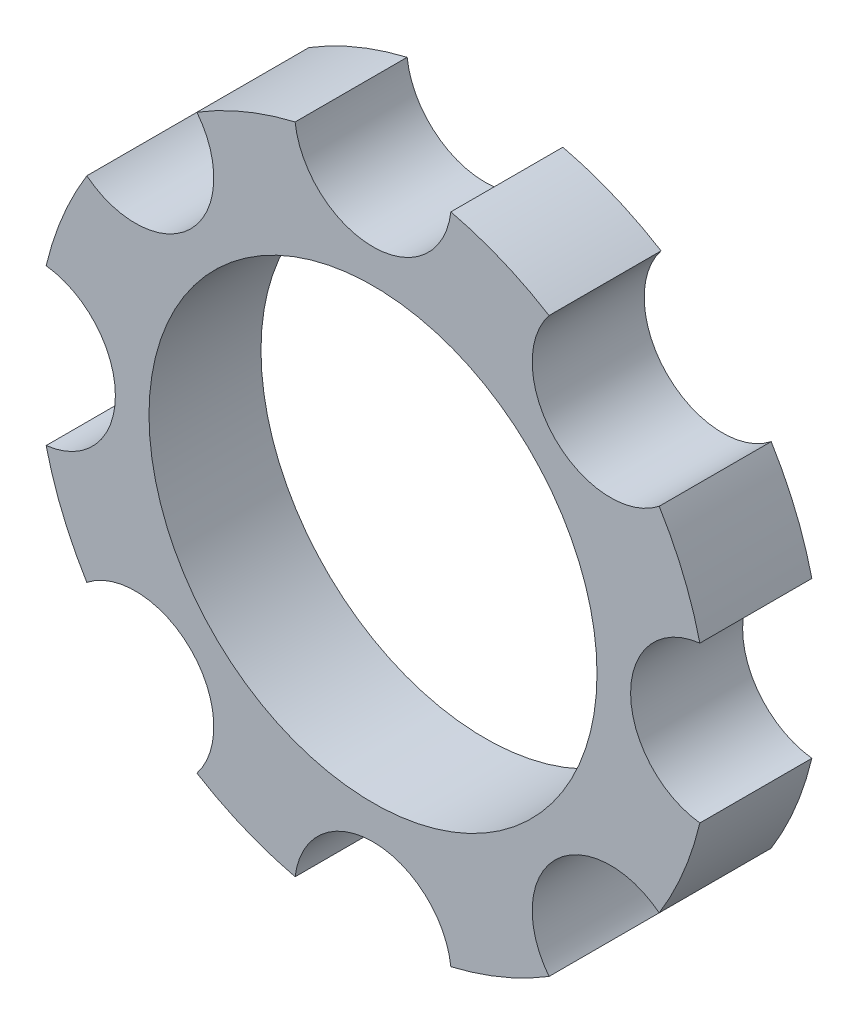
ISO-10303-21;
HEADER;
FILE_DESCRIPTION(('STEP AP214'),'2;1');
FILE_NAME('part.step','',(''),(''),'','','');
FILE_SCHEMA(('AUTOMOTIVE_DESIGN { 1 0 10303 214 1 1 1 1 }'));
ENDSEC;
DATA;
#1=APPLICATION_CONTEXT('core data for automotive mechanical design processes');
#2=APPLICATION_PROTOCOL_DEFINITION('international standard','automotive_design',2000,#1);
#3=PRODUCT_CONTEXT('',#1,'mechanical');
#4=PRODUCT('Part','Part','',(#3));
#5=PRODUCT_RELATED_PRODUCT_CATEGORY('part','',(#4));
#6=PRODUCT_DEFINITION_FORMATION('','',#4);
#7=PRODUCT_DEFINITION_CONTEXT('part definition',#1,'design');
#8=PRODUCT_DEFINITION('design','',#6,#7);
#9=PRODUCT_DEFINITION_SHAPE('','',#8);
#10=(LENGTH_UNIT() NAMED_UNIT(*) SI_UNIT(.MILLI.,.METRE.));
#11=(NAMED_UNIT(*) PLANE_ANGLE_UNIT() SI_UNIT($,.RADIAN.));
#12=(NAMED_UNIT(*) SI_UNIT($,.STERADIAN.) SOLID_ANGLE_UNIT());
#13=UNCERTAINTY_MEASURE_WITH_UNIT(LENGTH_MEASURE(1.E-05),#10,'distance_accuracy_value','');
#14=(GEOMETRIC_REPRESENTATION_CONTEXT(3) GLOBAL_UNCERTAINTY_ASSIGNED_CONTEXT((#13)) GLOBAL_UNIT_ASSIGNED_CONTEXT((#10,
#11,#12)) REPRESENTATION_CONTEXT('',''));
#15=CARTESIAN_POINT('',(0.,0.,0.));
#16=DIRECTION('',(0.,0.,1.));
#17=DIRECTION('',(1.,0.,0.));
#18=AXIS2_PLACEMENT_3D('',#15,#16,#17);
#19=CARTESIAN_POINT('',(0.,15.,10.));
#20=DIRECTION('',(0.,0.,1.));
#21=DIRECTION('',(1.,0.,0.));
#22=AXIS2_PLACEMENT_3D('',#19,#20,#21);
#23=PLANE('',#22);
#24=CARTESIAN_POINT('',(0.,0.,10.));
#25=DIRECTION('',(0.,0.,1.));
#26=DIRECTION('',(1.,0.,0.));
#27=AXIS2_PLACEMENT_3D('',#24,#25,#26);
#28=CIRCLE('',#27,30.);
#29=CARTESIAN_POINT('',(15.7197866227198,25.551679172535,10.));
#30=VERTEX_POINT('',#29);
#31=CARTESIAN_POINT('',(6.95219789387181,29.1833333333333,10.));
#32=VERTEX_POINT('',#31);
#33=EDGE_CURVE('E209',#30,#32,#28,.T.);
#34=ORIENTED_EDGE('',*,*,#33,.T.);
#35=CARTESIAN_POINT('',(0.,30.,10.));
#36=DIRECTION('',(0.,0.,-1.));
#37=DIRECTION('',(1.,0.,0.));
#38=AXIS2_PLACEMENT_3D('',#35,#36,#37);
#39=CIRCLE('',#38,7.00000000000001);
#40=CARTESIAN_POINT('',(-6.95219789387181,29.1833333333333,10.));
#41=VERTEX_POINT('',#40);
#42=EDGE_CURVE('E117',#32,#41,#39,.T.);
#43=ORIENTED_EDGE('',*,*,#42,.T.);
#44=CARTESIAN_POINT('',(0.,0.,10.));
#45=DIRECTION('',(0.,0.,1.));
#46=DIRECTION('',(1.,0.,0.));
#47=AXIS2_PLACEMENT_3D('',#44,#45,#46);
#48=CIRCLE('',#47,30.);
#49=CARTESIAN_POINT('',(-15.7197866227198,25.551679172535,10.));
#50=VERTEX_POINT('',#49);
#51=EDGE_CURVE('E248',#41,#50,#48,.T.);
#52=ORIENTED_EDGE('',*,*,#51,.T.);
#53=CARTESIAN_POINT('',(-21.2132034355964,21.2132034355964,10.));
#54=DIRECTION('',(0.,0.,-1.));
#55=DIRECTION('',(1.,0.,0.));
#56=AXIS2_PLACEMENT_3D('',#53,#54,#55);
#57=CIRCLE('',#56,7.00000000000001);
#58=CARTESIAN_POINT('',(-25.551679172535,15.7197866227198,10.));
#59=VERTEX_POINT('',#58);
#60=EDGE_CURVE('E267',#50,#59,#57,.T.);
#61=ORIENTED_EDGE('',*,*,#60,.T.);
#62=CARTESIAN_POINT('',(0.,0.,10.));
#63=DIRECTION('',(0.,0.,1.));
#64=DIRECTION('',(1.,0.,0.));
#65=AXIS2_PLACEMENT_3D('',#62,#63,#64);
#66=CIRCLE('',#65,30.);
#67=CARTESIAN_POINT('',(-29.1833333333333,6.95219789387179,10.));
#68=VERTEX_POINT('',#67);
#69=EDGE_CURVE('E264',#59,#68,#66,.T.);
#70=ORIENTED_EDGE('',*,*,#69,.T.);
#71=CARTESIAN_POINT('',(-30.,0.,10.));
#72=DIRECTION('',(0.,0.,-1.));
#73=DIRECTION('',(1.,0.,0.));
#74=AXIS2_PLACEMENT_3D('',#71,#72,#73);
#75=CIRCLE('',#74,7.);
#76=CARTESIAN_POINT('',(-29.1833333333333,-6.95219789387182,10.));
#77=VERTEX_POINT('',#76);
#78=EDGE_CURVE('E266',#68,#77,#75,.T.);
#79=ORIENTED_EDGE('',*,*,#78,.T.);
#80=CARTESIAN_POINT('',(0.,0.,10.));
#81=DIRECTION('',(0.,0.,1.));
#82=DIRECTION('',(1.,0.,0.));
#83=AXIS2_PLACEMENT_3D('',#80,#81,#82);
#84=CIRCLE('',#83,30.);
#85=CARTESIAN_POINT('',(-25.551679172535,-15.7197866227198,10.));
#86=VERTEX_POINT('',#85);
#87=EDGE_CURVE('E269',#77,#86,#84,.T.);
#88=ORIENTED_EDGE('',*,*,#87,.T.);
#89=CARTESIAN_POINT('',(-21.2132034355964,-21.2132034355964,10.));
#90=DIRECTION('',(0.,0.,-1.));
#91=DIRECTION('',(1.,0.,0.));
#92=AXIS2_PLACEMENT_3D('',#89,#90,#91);
#93=CIRCLE('',#92,7.00000000000001);
#94=CARTESIAN_POINT('',(-15.7197866227198,-25.551679172535,10.));
#95=VERTEX_POINT('',#94);
#96=EDGE_CURVE('E275',#86,#95,#93,.T.);
#97=ORIENTED_EDGE('',*,*,#96,.T.);
#98=CARTESIAN_POINT('',(0.,0.,10.));
#99=DIRECTION('',(0.,0.,1.));
#100=DIRECTION('',(1.,0.,0.));
#101=AXIS2_PLACEMENT_3D('',#98,#99,#100);
#102=CIRCLE('',#101,30.);
#103=CARTESIAN_POINT('',(-6.95219789387181,-29.1833333333333,10.));
#104=VERTEX_POINT('',#103);
#105=EDGE_CURVE('E277',#95,#104,#102,.T.);
#106=ORIENTED_EDGE('',*,*,#105,.T.);
#107=CARTESIAN_POINT('',(0.,-30.,10.));
#108=DIRECTION('',(0.,0.,-1.));
#109=DIRECTION('',(1.,0.,0.));
#110=AXIS2_PLACEMENT_3D('',#107,#108,#109);
#111=CIRCLE('',#110,7.00000000000001);
#112=CARTESIAN_POINT('',(6.95219789387182,-29.1833333333333,10.));
#113=VERTEX_POINT('',#112);
#114=EDGE_CURVE('E279',#104,#113,#111,.T.);
#115=ORIENTED_EDGE('',*,*,#114,.T.);
#116=CARTESIAN_POINT('',(0.,0.,10.));
#117=DIRECTION('',(0.,0.,1.));
#118=DIRECTION('',(1.,0.,0.));
#119=AXIS2_PLACEMENT_3D('',#116,#117,#118);
#120=CIRCLE('',#119,30.);
#121=CARTESIAN_POINT('',(15.7197866227198,-25.551679172535,10.));
#122=VERTEX_POINT('',#121);
#123=EDGE_CURVE('E281',#113,#122,#120,.T.);
#124=ORIENTED_EDGE('',*,*,#123,.T.);
#125=CARTESIAN_POINT('',(21.2132034355964,-21.2132034355964,10.));
#126=DIRECTION('',(0.,0.,-1.));
#127=DIRECTION('',(1.,0.,0.));
#128=AXIS2_PLACEMENT_3D('',#125,#126,#127);
#129=CIRCLE('',#128,7.00000000000001);
#130=CARTESIAN_POINT('',(25.551679172535,-15.7197866227198,10.));
#131=VERTEX_POINT('',#130);
#132=EDGE_CURVE('E283',#122,#131,#129,.T.);
#133=ORIENTED_EDGE('',*,*,#132,.T.);
#134=CARTESIAN_POINT('',(0.,0.,10.));
#135=DIRECTION('',(0.,0.,1.));
#136=DIRECTION('',(1.,0.,0.));
#137=AXIS2_PLACEMENT_3D('',#134,#135,#136);
#138=CIRCLE('',#137,30.);
#139=CARTESIAN_POINT('',(29.1833333333333,-6.95219789387181,10.));
#140=VERTEX_POINT('',#139);
#141=EDGE_CURVE('E160',#131,#140,#138,.T.);
#142=ORIENTED_EDGE('',*,*,#141,.T.);
#143=CARTESIAN_POINT('',(30.,0.,10.));
#144=DIRECTION('',(0.,0.,-1.));
#145=DIRECTION('',(1.,0.,0.));
#146=AXIS2_PLACEMENT_3D('',#143,#144,#145);
#147=CIRCLE('',#146,7.00000000000001);
#148=CARTESIAN_POINT('',(29.1833333333333,6.95219789387182,10.));
#149=VERTEX_POINT('',#148);
#150=EDGE_CURVE('E154',#140,#149,#147,.T.);
#151=ORIENTED_EDGE('',*,*,#150,.T.);
#152=CARTESIAN_POINT('',(0.,0.,10.));
#153=DIRECTION('',(0.,0.,1.));
#154=DIRECTION('',(1.,0.,0.));
#155=AXIS2_PLACEMENT_3D('',#152,#153,#154);
#156=CIRCLE('',#155,30.);
#157=CARTESIAN_POINT('',(25.551679172535,15.7197866227198,10.));
#158=VERTEX_POINT('',#157);
#159=EDGE_CURVE('E158',#149,#158,#156,.T.);
#160=ORIENTED_EDGE('',*,*,#159,.T.);
#161=CARTESIAN_POINT('',(21.2132034355964,21.2132034355964,10.));
#162=DIRECTION('',(0.,0.,-1.));
#163=DIRECTION('',(1.,0.,0.));
#164=AXIS2_PLACEMENT_3D('',#161,#162,#163);
#165=CIRCLE('',#164,7.00000000000001);
#166=EDGE_CURVE('E50',#158,#30,#165,.T.);
#167=ORIENTED_EDGE('',*,*,#166,.T.);
#168=EDGE_LOOP('',(#34,#43,#52,#61,#70,#79,#88,#97,#106,#115,#124,#133,#142,#151,#160,#167));
#169=FACE_BOUND('',#168,.T.);
#170=CARTESIAN_POINT('',(0.,0.,10.));
#171=DIRECTION('',(0.,0.,1.));
#172=DIRECTION('',(1.,0.,0.));
#173=AXIS2_PLACEMENT_3D('',#170,#171,#172);
#174=CIRCLE('',#173,20.);
#175=CARTESIAN_POINT('',(20.,0.,10.));
#176=VERTEX_POINT('',#175);
#177=EDGE_CURVE('E182',#176,#176,#174,.T.);
#178=ORIENTED_EDGE('',*,*,#177,.F.);
#179=EDGE_LOOP('',(#178));
#180=FACE_BOUND('',#179,.T.);
#181=ADVANCED_FACE('F33',(#169,#180),#23,.T.);
#182=CARTESIAN_POINT('',(0.,15.,0.));
#183=DIRECTION('',(0.,0.,1.));
#184=DIRECTION('',(1.,0.,0.));
#185=AXIS2_PLACEMENT_3D('',#182,#183,#184);
#186=PLANE('',#185);
#187=CARTESIAN_POINT('',(0.,0.,0.));
#188=DIRECTION('',(0.,0.,1.));
#189=DIRECTION('',(1.,0.,0.));
#190=AXIS2_PLACEMENT_3D('',#187,#188,#189);
#191=CIRCLE('',#190,30.);
#192=CARTESIAN_POINT('',(15.7197866227198,25.551679172535,0.));
#193=VERTEX_POINT('',#192);
#194=CARTESIAN_POINT('',(6.95219789387181,29.1833333333333,0.));
#195=VERTEX_POINT('',#194);
#196=EDGE_CURVE('E178',#193,#195,#191,.T.);
#197=ORIENTED_EDGE('',*,*,#196,.F.);
#198=CARTESIAN_POINT('',(21.2132034355964,21.2132034355964,0.));
#199=DIRECTION('',(0.,0.,-1.));
#200=DIRECTION('',(1.,0.,0.));
#201=AXIS2_PLACEMENT_3D('',#198,#199,#200);
#202=CIRCLE('',#201,7.00000000000001);
#203=CARTESIAN_POINT('',(25.551679172535,15.7197866227198,0.));
#204=VERTEX_POINT('',#203);
#205=EDGE_CURVE('E109',#204,#193,#202,.T.);
#206=ORIENTED_EDGE('',*,*,#205,.F.);
#207=CARTESIAN_POINT('',(0.,0.,0.));
#208=DIRECTION('',(0.,0.,1.));
#209=DIRECTION('',(1.,0.,0.));
#210=AXIS2_PLACEMENT_3D('',#207,#208,#209);
#211=CIRCLE('',#210,30.);
#212=CARTESIAN_POINT('',(29.1833333333333,6.95219789387182,0.));
#213=VERTEX_POINT('',#212);
#214=EDGE_CURVE('E103',#213,#204,#211,.T.);
#215=ORIENTED_EDGE('',*,*,#214,.F.);
#216=CARTESIAN_POINT('',(30.,0.,0.));
#217=DIRECTION('',(0.,0.,-1.));
#218=DIRECTION('',(1.,0.,0.));
#219=AXIS2_PLACEMENT_3D('',#216,#217,#218);
#220=CIRCLE('',#219,7.00000000000001);
#221=CARTESIAN_POINT('',(29.1833333333333,-6.95219789387181,0.));
#222=VERTEX_POINT('',#221);
#223=EDGE_CURVE('E168',#222,#213,#220,.T.);
#224=ORIENTED_EDGE('',*,*,#223,.F.);
#225=CARTESIAN_POINT('',(0.,0.,0.));
#226=DIRECTION('',(0.,0.,1.));
#227=DIRECTION('',(1.,0.,0.));
#228=AXIS2_PLACEMENT_3D('',#225,#226,#227);
#229=CIRCLE('',#228,30.);
#230=CARTESIAN_POINT('',(25.551679172535,-15.7197866227198,0.));
#231=VERTEX_POINT('',#230);
#232=EDGE_CURVE('E204',#231,#222,#229,.T.);
#233=ORIENTED_EDGE('',*,*,#232,.F.);
#234=CARTESIAN_POINT('',(21.2132034355964,-21.2132034355964,0.));
#235=DIRECTION('',(0.,0.,-1.));
#236=DIRECTION('',(1.,0.,0.));
#237=AXIS2_PLACEMENT_3D('',#234,#235,#236);
#238=CIRCLE('',#237,7.00000000000001);
#239=CARTESIAN_POINT('',(15.7197866227198,-25.551679172535,0.));
#240=VERTEX_POINT('',#239);
#241=EDGE_CURVE('E202',#240,#231,#238,.T.);
#242=ORIENTED_EDGE('',*,*,#241,.F.);
#243=CARTESIAN_POINT('',(0.,0.,0.));
#244=DIRECTION('',(0.,0.,1.));
#245=DIRECTION('',(1.,0.,0.));
#246=AXIS2_PLACEMENT_3D('',#243,#244,#245);
#247=CIRCLE('',#246,30.);
#248=CARTESIAN_POINT('',(6.95219789387182,-29.1833333333333,0.));
#249=VERTEX_POINT('',#248);
#250=EDGE_CURVE('E200',#249,#240,#247,.T.);
#251=ORIENTED_EDGE('',*,*,#250,.F.);
#252=CARTESIAN_POINT('',(0.,-30.,0.));
#253=DIRECTION('',(0.,0.,-1.));
#254=DIRECTION('',(1.,0.,0.));
#255=AXIS2_PLACEMENT_3D('',#252,#253,#254);
#256=CIRCLE('',#255,7.00000000000001);
#257=CARTESIAN_POINT('',(-6.95219789387181,-29.1833333333333,0.));
#258=VERTEX_POINT('',#257);
#259=EDGE_CURVE('E198',#258,#249,#256,.T.);
#260=ORIENTED_EDGE('',*,*,#259,.F.);
#261=CARTESIAN_POINT('',(0.,0.,0.));
#262=DIRECTION('',(0.,0.,1.));
#263=DIRECTION('',(1.,0.,0.));
#264=AXIS2_PLACEMENT_3D('',#261,#262,#263);
#265=CIRCLE('',#264,30.);
#266=CARTESIAN_POINT('',(-15.7197866227198,-25.551679172535,0.));
#267=VERTEX_POINT('',#266);
#268=EDGE_CURVE('E196',#267,#258,#265,.T.);
#269=ORIENTED_EDGE('',*,*,#268,.F.);
#270=CARTESIAN_POINT('',(-21.2132034355964,-21.2132034355964,0.));
#271=DIRECTION('',(0.,0.,-1.));
#272=DIRECTION('',(1.,0.,0.));
#273=AXIS2_PLACEMENT_3D('',#270,#271,#272);
#274=CIRCLE('',#273,7.00000000000001);
#275=CARTESIAN_POINT('',(-25.551679172535,-15.7197866227198,0.));
#276=VERTEX_POINT('',#275);
#277=EDGE_CURVE('E194',#276,#267,#274,.T.);
#278=ORIENTED_EDGE('',*,*,#277,.F.);
#279=CARTESIAN_POINT('',(0.,0.,0.));
#280=DIRECTION('',(0.,0.,1.));
#281=DIRECTION('',(1.,0.,0.));
#282=AXIS2_PLACEMENT_3D('',#279,#280,#281);
#283=CIRCLE('',#282,30.);
#284=CARTESIAN_POINT('',(-29.1833333333333,-6.95219789387182,0.));
#285=VERTEX_POINT('',#284);
#286=EDGE_CURVE('E192',#285,#276,#283,.T.);
#287=ORIENTED_EDGE('',*,*,#286,.F.);
#288=CARTESIAN_POINT('',(-30.,0.,0.));
#289=DIRECTION('',(0.,0.,-1.));
#290=DIRECTION('',(1.,0.,0.));
#291=AXIS2_PLACEMENT_3D('',#288,#289,#290);
#292=CIRCLE('',#291,7.);
#293=CARTESIAN_POINT('',(-29.1833333333333,6.95219789387179,0.));
#294=VERTEX_POINT('',#293);
#295=EDGE_CURVE('E190',#294,#285,#292,.T.);
#296=ORIENTED_EDGE('',*,*,#295,.F.);
#297=CARTESIAN_POINT('',(0.,0.,0.));
#298=DIRECTION('',(0.,0.,1.));
#299=DIRECTION('',(1.,0.,0.));
#300=AXIS2_PLACEMENT_3D('',#297,#298,#299);
#301=CIRCLE('',#300,30.);
#302=CARTESIAN_POINT('',(-25.551679172535,15.7197866227198,0.));
#303=VERTEX_POINT('',#302);
#304=EDGE_CURVE('E188',#303,#294,#301,.T.);
#305=ORIENTED_EDGE('',*,*,#304,.F.);
#306=CARTESIAN_POINT('',(-21.2132034355964,21.2132034355964,0.));
#307=DIRECTION('',(0.,0.,-1.));
#308=DIRECTION('',(1.,0.,0.));
#309=AXIS2_PLACEMENT_3D('',#306,#307,#308);
#310=CIRCLE('',#309,7.00000000000001);
#311=CARTESIAN_POINT('',(-15.7197866227198,25.551679172535,0.));
#312=VERTEX_POINT('',#311);
#313=EDGE_CURVE('E186',#312,#303,#310,.T.);
#314=ORIENTED_EDGE('',*,*,#313,.F.);
#315=CARTESIAN_POINT('',(0.,0.,0.));
#316=DIRECTION('',(0.,0.,1.));
#317=DIRECTION('',(1.,0.,0.));
#318=AXIS2_PLACEMENT_3D('',#315,#316,#317);
#319=CIRCLE('',#318,30.);
#320=CARTESIAN_POINT('',(-6.95219789387181,29.1833333333333,0.));
#321=VERTEX_POINT('',#320);
#322=EDGE_CURVE('E184',#321,#312,#319,.T.);
#323=ORIENTED_EDGE('',*,*,#322,.F.);
#324=CARTESIAN_POINT('',(0.,30.,0.));
#325=DIRECTION('',(0.,0.,-1.));
#326=DIRECTION('',(1.,0.,0.));
#327=AXIS2_PLACEMENT_3D('',#324,#325,#326);
#328=CIRCLE('',#327,7.00000000000001);
#329=EDGE_CURVE('E181',#195,#321,#328,.T.);
#330=ORIENTED_EDGE('',*,*,#329,.F.);
#331=EDGE_LOOP('',(#197,#206,#215,#224,#233,#242,#251,#260,#269,#278,#287,#296,#305,#314,#323,#330));
#332=FACE_BOUND('',#331,.T.);
#333=CARTESIAN_POINT('',(0.,0.,0.));
#334=DIRECTION('',(0.,0.,1.));
#335=DIRECTION('',(1.,0.,0.));
#336=AXIS2_PLACEMENT_3D('',#333,#334,#335);
#337=CIRCLE('',#336,20.);
#338=CARTESIAN_POINT('',(20.,0.,0.));
#339=VERTEX_POINT('',#338);
#340=EDGE_CURVE('E482',#339,#339,#337,.T.);
#341=ORIENTED_EDGE('',*,*,#340,.T.);
#342=EDGE_LOOP('',(#341));
#343=FACE_BOUND('',#342,.T.);
#344=ADVANCED_FACE('F252',(#332,#343),#186,.F.);
#345=CARTESIAN_POINT('',(0.,0.,10.));
#346=DIRECTION('',(0.,0.,-1.));
#347=DIRECTION('',(-1.,0.,0.));
#348=AXIS2_PLACEMENT_3D('',#345,#346,#347);
#349=CYLINDRICAL_SURFACE('',#348,30.);
#350=ORIENTED_EDGE('',*,*,#196,.T.);
#351=DIRECTION('',(0.,0.,-1.));
#352=VECTOR('',#351,1.);
#353=CARTESIAN_POINT('',(6.95219789387181,29.1833333333333,10.));
#354=LINE('',#353,#352);
#355=EDGE_CURVE('E11',#32,#195,#354,.T.);
#356=ORIENTED_EDGE('',*,*,#355,.F.);
#357=ORIENTED_EDGE('',*,*,#33,.F.);
#358=DIRECTION('',(0.,0.,-1.));
#359=VECTOR('',#358,1.);
#360=CARTESIAN_POINT('',(15.7197866227198,25.551679172535,10.));
#361=LINE('',#360,#359);
#362=EDGE_CURVE('E174',#30,#193,#361,.T.);
#363=ORIENTED_EDGE('',*,*,#362,.T.);
#364=EDGE_LOOP('',(#350,#356,#357,#363));
#365=FACE_BOUND('',#364,.T.);
#366=ADVANCED_FACE('F35',(#365),#349,.T.);
#367=CARTESIAN_POINT('',(0.,30.,10.));
#368=DIRECTION('',(0.,0.,-1.));
#369=DIRECTION('',(-1.,0.,0.));
#370=AXIS2_PLACEMENT_3D('',#367,#368,#369);
#371=CYLINDRICAL_SURFACE('',#370,7.00000000000001);
#372=ORIENTED_EDGE('',*,*,#329,.T.);
#373=DIRECTION('',(0.,0.,-1.));
#374=VECTOR('',#373,1.);
#375=CARTESIAN_POINT('',(-6.95219789387181,29.1833333333333,10.));
#376=LINE('',#375,#374);
#377=EDGE_CURVE('E42',#41,#321,#376,.T.);
#378=ORIENTED_EDGE('',*,*,#377,.F.);
#379=ORIENTED_EDGE('',*,*,#42,.F.);
#380=ORIENTED_EDGE('',*,*,#355,.T.);
#381=EDGE_LOOP('',(#372,#378,#379,#380));
#382=FACE_BOUND('',#381,.T.);
#383=ADVANCED_FACE('F317',(#382),#371,.F.);
#384=CARTESIAN_POINT('',(0.,0.,10.));
#385=DIRECTION('',(0.,0.,-1.));
#386=DIRECTION('',(-1.,0.,0.));
#387=AXIS2_PLACEMENT_3D('',#384,#385,#386);
#388=CYLINDRICAL_SURFACE('',#387,30.);
#389=ORIENTED_EDGE('',*,*,#322,.T.);
#390=DIRECTION('',(0.,0.,-1.));
#391=VECTOR('',#390,1.);
#392=CARTESIAN_POINT('',(-15.7197866227198,25.551679172535,10.));
#393=LINE('',#392,#391);
#394=EDGE_CURVE('E240',#50,#312,#393,.T.);
#395=ORIENTED_EDGE('',*,*,#394,.F.);
#396=ORIENTED_EDGE('',*,*,#51,.F.);
#397=ORIENTED_EDGE('',*,*,#377,.T.);
#398=EDGE_LOOP('',(#389,#395,#396,#397));
#399=FACE_BOUND('',#398,.T.);
#400=ADVANCED_FACE('F246',(#399),#388,.T.);
#401=CARTESIAN_POINT('',(-21.2132034355964,21.2132034355964,10.));
#402=DIRECTION('',(0.,0.,-1.));
#403=DIRECTION('',(-1.,0.,0.));
#404=AXIS2_PLACEMENT_3D('',#401,#402,#403);
#405=CYLINDRICAL_SURFACE('',#404,7.00000000000001);
#406=ORIENTED_EDGE('',*,*,#313,.T.);
#407=DIRECTION('',(0.,0.,-1.));
#408=VECTOR('',#407,1.);
#409=CARTESIAN_POINT('',(-25.551679172535,15.7197866227198,10.));
#410=LINE('',#409,#408);
#411=EDGE_CURVE('E237',#59,#303,#410,.T.);
#412=ORIENTED_EDGE('',*,*,#411,.F.);
#413=ORIENTED_EDGE('',*,*,#60,.F.);
#414=ORIENTED_EDGE('',*,*,#394,.T.);
#415=EDGE_LOOP('',(#406,#412,#413,#414));
#416=FACE_BOUND('',#415,.T.);
#417=ADVANCED_FACE('F258',(#416),#405,.F.);
#418=CARTESIAN_POINT('',(0.,0.,10.));
#419=DIRECTION('',(0.,0.,-1.));
#420=DIRECTION('',(-1.,0.,0.));
#421=AXIS2_PLACEMENT_3D('',#418,#419,#420);
#422=CYLINDRICAL_SURFACE('',#421,30.);
#423=ORIENTED_EDGE('',*,*,#304,.T.);
#424=DIRECTION('',(0.,0.,-1.));
#425=VECTOR('',#424,1.);
#426=CARTESIAN_POINT('',(-29.1833333333333,6.95219789387179,10.));
#427=LINE('',#426,#425);
#428=EDGE_CURVE('E234',#68,#294,#427,.T.);
#429=ORIENTED_EDGE('',*,*,#428,.F.);
#430=ORIENTED_EDGE('',*,*,#69,.F.);
#431=ORIENTED_EDGE('',*,*,#411,.T.);
#432=EDGE_LOOP('',(#423,#429,#430,#431));
#433=FACE_BOUND('',#432,.T.);
#434=ADVANCED_FACE('F262',(#433),#422,.T.);
#435=CARTESIAN_POINT('',(-30.,0.,10.));
#436=DIRECTION('',(0.,0.,-1.));
#437=DIRECTION('',(-1.,0.,0.));
#438=AXIS2_PLACEMENT_3D('',#435,#436,#437);
#439=CYLINDRICAL_SURFACE('',#438,7.);
#440=ORIENTED_EDGE('',*,*,#295,.T.);
#441=DIRECTION('',(0.,0.,-1.));
#442=VECTOR('',#441,1.);
#443=CARTESIAN_POINT('',(-29.1833333333333,-6.95219789387182,10.));
#444=LINE('',#443,#442);
#445=EDGE_CURVE('E231',#77,#285,#444,.T.);
#446=ORIENTED_EDGE('',*,*,#445,.F.);
#447=ORIENTED_EDGE('',*,*,#78,.F.);
#448=ORIENTED_EDGE('',*,*,#428,.T.);
#449=EDGE_LOOP('',(#440,#446,#447,#448));
#450=FACE_BOUND('',#449,.T.);
#451=ADVANCED_FACE('F330',(#450),#439,.F.);
#452=CARTESIAN_POINT('',(0.,0.,10.));
#453=DIRECTION('',(0.,0.,-1.));
#454=DIRECTION('',(-1.,0.,0.));
#455=AXIS2_PLACEMENT_3D('',#452,#453,#454);
#456=CYLINDRICAL_SURFACE('',#455,30.);
#457=ORIENTED_EDGE('',*,*,#286,.T.);
#458=DIRECTION('',(0.,0.,-1.));
#459=VECTOR('',#458,1.);
#460=CARTESIAN_POINT('',(-25.551679172535,-15.7197866227198,10.));
#461=LINE('',#460,#459);
#462=EDGE_CURVE('E228',#86,#276,#461,.T.);
#463=ORIENTED_EDGE('',*,*,#462,.F.);
#464=ORIENTED_EDGE('',*,*,#87,.F.);
#465=ORIENTED_EDGE('',*,*,#445,.T.);
#466=EDGE_LOOP('',(#457,#463,#464,#465));
#467=FACE_BOUND('',#466,.T.);
#468=ADVANCED_FACE('F333',(#467),#456,.T.);
#469=CARTESIAN_POINT('',(-21.2132034355964,-21.2132034355964,10.));
#470=DIRECTION('',(0.,0.,-1.));
#471=DIRECTION('',(-1.,0.,0.));
#472=AXIS2_PLACEMENT_3D('',#469,#470,#471);
#473=CYLINDRICAL_SURFACE('',#472,7.00000000000001);
#474=ORIENTED_EDGE('',*,*,#277,.T.);
#475=DIRECTION('',(0.,0.,-1.));
#476=VECTOR('',#475,1.);
#477=CARTESIAN_POINT('',(-15.7197866227198,-25.551679172535,10.));
#478=LINE('',#477,#476);
#479=EDGE_CURVE('E225',#95,#267,#478,.T.);
#480=ORIENTED_EDGE('',*,*,#479,.F.);
#481=ORIENTED_EDGE('',*,*,#96,.F.);
#482=ORIENTED_EDGE('',*,*,#462,.T.);
#483=EDGE_LOOP('',(#474,#480,#481,#482));
#484=FACE_BOUND('',#483,.T.);
#485=ADVANCED_FACE('F337',(#484),#473,.F.);
#486=CARTESIAN_POINT('',(0.,0.,10.));
#487=DIRECTION('',(0.,0.,-1.));
#488=DIRECTION('',(-1.,0.,0.));
#489=AXIS2_PLACEMENT_3D('',#486,#487,#488);
#490=CYLINDRICAL_SURFACE('',#489,30.);
#491=ORIENTED_EDGE('',*,*,#268,.T.);
#492=DIRECTION('',(0.,0.,-1.));
#493=VECTOR('',#492,1.);
#494=CARTESIAN_POINT('',(-6.95219789387181,-29.1833333333333,10.));
#495=LINE('',#494,#493);
#496=EDGE_CURVE('E222',#104,#258,#495,.T.);
#497=ORIENTED_EDGE('',*,*,#496,.F.);
#498=ORIENTED_EDGE('',*,*,#105,.F.);
#499=ORIENTED_EDGE('',*,*,#479,.T.);
#500=EDGE_LOOP('',(#491,#497,#498,#499));
#501=FACE_BOUND('',#500,.T.);
#502=ADVANCED_FACE('F341',(#501),#490,.T.);
#503=CARTESIAN_POINT('',(0.,-30.,10.));
#504=DIRECTION('',(0.,0.,-1.));
#505=DIRECTION('',(-1.,0.,0.));
#506=AXIS2_PLACEMENT_3D('',#503,#504,#505);
#507=CYLINDRICAL_SURFACE('',#506,7.00000000000001);
#508=ORIENTED_EDGE('',*,*,#259,.T.);
#509=DIRECTION('',(0.,0.,-1.));
#510=VECTOR('',#509,1.);
#511=CARTESIAN_POINT('',(6.95219789387182,-29.1833333333333,10.));
#512=LINE('',#511,#510);
#513=EDGE_CURVE('E219',#113,#249,#512,.T.);
#514=ORIENTED_EDGE('',*,*,#513,.F.);
#515=ORIENTED_EDGE('',*,*,#114,.F.);
#516=ORIENTED_EDGE('',*,*,#496,.T.);
#517=EDGE_LOOP('',(#508,#514,#515,#516));
#518=FACE_BOUND('',#517,.T.);
#519=ADVANCED_FACE('F345',(#518),#507,.F.);
#520=CARTESIAN_POINT('',(0.,0.,10.));
#521=DIRECTION('',(0.,0.,-1.));
#522=DIRECTION('',(-1.,0.,0.));
#523=AXIS2_PLACEMENT_3D('',#520,#521,#522);
#524=CYLINDRICAL_SURFACE('',#523,30.);
#525=ORIENTED_EDGE('',*,*,#250,.T.);
#526=DIRECTION('',(0.,0.,-1.));
#527=VECTOR('',#526,1.);
#528=CARTESIAN_POINT('',(15.7197866227198,-25.551679172535,10.));
#529=LINE('',#528,#527);
#530=EDGE_CURVE('E216',#122,#240,#529,.T.);
#531=ORIENTED_EDGE('',*,*,#530,.F.);
#532=ORIENTED_EDGE('',*,*,#123,.F.);
#533=ORIENTED_EDGE('',*,*,#513,.T.);
#534=EDGE_LOOP('',(#525,#531,#532,#533));
#535=FACE_BOUND('',#534,.T.);
#536=ADVANCED_FACE('F349',(#535),#524,.T.);
#537=CARTESIAN_POINT('',(21.2132034355964,-21.2132034355964,10.));
#538=DIRECTION('',(0.,0.,-1.));
#539=DIRECTION('',(-1.,0.,0.));
#540=AXIS2_PLACEMENT_3D('',#537,#538,#539);
#541=CYLINDRICAL_SURFACE('',#540,7.00000000000001);
#542=ORIENTED_EDGE('',*,*,#241,.T.);
#543=DIRECTION('',(0.,0.,-1.));
#544=VECTOR('',#543,1.);
#545=CARTESIAN_POINT('',(25.551679172535,-15.7197866227198,10.));
#546=LINE('',#545,#544);
#547=EDGE_CURVE('E213',#131,#231,#546,.T.);
#548=ORIENTED_EDGE('',*,*,#547,.F.);
#549=ORIENTED_EDGE('',*,*,#132,.F.);
#550=ORIENTED_EDGE('',*,*,#530,.T.);
#551=EDGE_LOOP('',(#542,#548,#549,#550));
#552=FACE_BOUND('',#551,.T.);
#553=ADVANCED_FACE('F289',(#552),#541,.F.);
#554=CARTESIAN_POINT('',(0.,0.,10.));
#555=DIRECTION('',(0.,0.,-1.));
#556=DIRECTION('',(-1.,0.,0.));
#557=AXIS2_PLACEMENT_3D('',#554,#555,#556);
#558=CYLINDRICAL_SURFACE('',#557,30.);
#559=ORIENTED_EDGE('',*,*,#232,.T.);
#560=DIRECTION('',(0.,0.,-1.));
#561=VECTOR('',#560,1.);
#562=CARTESIAN_POINT('',(29.1833333333333,-6.95219789387181,10.));
#563=LINE('',#562,#561);
#564=EDGE_CURVE('E169',#140,#222,#563,.T.);
#565=ORIENTED_EDGE('',*,*,#564,.F.);
#566=ORIENTED_EDGE('',*,*,#141,.F.);
#567=ORIENTED_EDGE('',*,*,#547,.T.);
#568=EDGE_LOOP('',(#559,#565,#566,#567));
#569=FACE_BOUND('',#568,.T.);
#570=ADVANCED_FACE('F293',(#569),#558,.T.);
#571=CARTESIAN_POINT('',(30.,0.,10.));
#572=DIRECTION('',(0.,0.,-1.));
#573=DIRECTION('',(-1.,0.,0.));
#574=AXIS2_PLACEMENT_3D('',#571,#572,#573);
#575=CYLINDRICAL_SURFACE('',#574,7.00000000000001);
#576=ORIENTED_EDGE('',*,*,#223,.T.);
#577=DIRECTION('',(0.,0.,-1.));
#578=VECTOR('',#577,1.);
#579=CARTESIAN_POINT('',(29.1833333333333,6.95219789387182,10.));
#580=LINE('',#579,#578);
#581=EDGE_CURVE('E165',#149,#213,#580,.T.);
#582=ORIENTED_EDGE('',*,*,#581,.F.);
#583=ORIENTED_EDGE('',*,*,#150,.F.);
#584=ORIENTED_EDGE('',*,*,#564,.T.);
#585=EDGE_LOOP('',(#576,#582,#583,#584));
#586=FACE_BOUND('',#585,.T.);
#587=ADVANCED_FACE('F166',(#586),#575,.F.);
#588=CARTESIAN_POINT('',(0.,0.,10.));
#589=DIRECTION('',(0.,0.,-1.));
#590=DIRECTION('',(-1.,0.,0.));
#591=AXIS2_PLACEMENT_3D('',#588,#589,#590);
#592=CYLINDRICAL_SURFACE('',#591,30.);
#593=ORIENTED_EDGE('',*,*,#214,.T.);
#594=DIRECTION('',(0.,0.,-1.));
#595=VECTOR('',#594,1.);
#596=CARTESIAN_POINT('',(25.551679172535,15.7197866227198,10.));
#597=LINE('',#596,#595);
#598=EDGE_CURVE('E170',#158,#204,#597,.T.);
#599=ORIENTED_EDGE('',*,*,#598,.F.);
#600=ORIENTED_EDGE('',*,*,#159,.F.);
#601=ORIENTED_EDGE('',*,*,#581,.T.);
#602=EDGE_LOOP('',(#593,#599,#600,#601));
#603=FACE_BOUND('',#602,.T.);
#604=ADVANCED_FACE('F172',(#603),#592,.T.);
#605=CARTESIAN_POINT('',(21.2132034355964,21.2132034355964,10.));
#606=DIRECTION('',(0.,0.,-1.));
#607=DIRECTION('',(-1.,0.,0.));
#608=AXIS2_PLACEMENT_3D('',#605,#606,#607);
#609=CYLINDRICAL_SURFACE('',#608,7.00000000000001);
#610=ORIENTED_EDGE('',*,*,#205,.T.);
#611=ORIENTED_EDGE('',*,*,#362,.F.);
#612=ORIENTED_EDGE('',*,*,#166,.F.);
#613=ORIENTED_EDGE('',*,*,#598,.T.);
#614=EDGE_LOOP('',(#610,#611,#612,#613));
#615=FACE_BOUND('',#614,.T.);
#616=ADVANCED_FACE('F297',(#615),#609,.F.);
#617=CARTESIAN_POINT('',(0.,0.,10.));
#618=DIRECTION('',(0.,0.,-1.));
#619=DIRECTION('',(-1.,0.,0.));
#620=AXIS2_PLACEMENT_3D('',#617,#618,#619);
#621=CYLINDRICAL_SURFACE('',#620,20.);
#622=ORIENTED_EDGE('',*,*,#177,.T.);
#623=EDGE_LOOP('',(#622));
#624=FACE_BOUND('',#623,.T.);
#625=ORIENTED_EDGE('',*,*,#340,.F.);
#626=EDGE_LOOP('',(#625));
#627=FACE_BOUND('',#626,.T.);
#628=ADVANCED_FACE('F299',(#624,#627),#621,.F.);
#629=CLOSED_SHELL('',(#181,#344,#366,#383,#400,#417,#434,#451,#468,#485,#502,#519,#536,#553,
#570,#587,#604,#616,#628));
#630=MANIFOLD_SOLID_BREP('B2',#629);
#631=ADVANCED_BREP_SHAPE_REPRESENTATION('',(#18,#630),#14);
#632=SHAPE_DEFINITION_REPRESENTATION(#9,#631);
ENDSEC;
END-ISO-10303-21;
